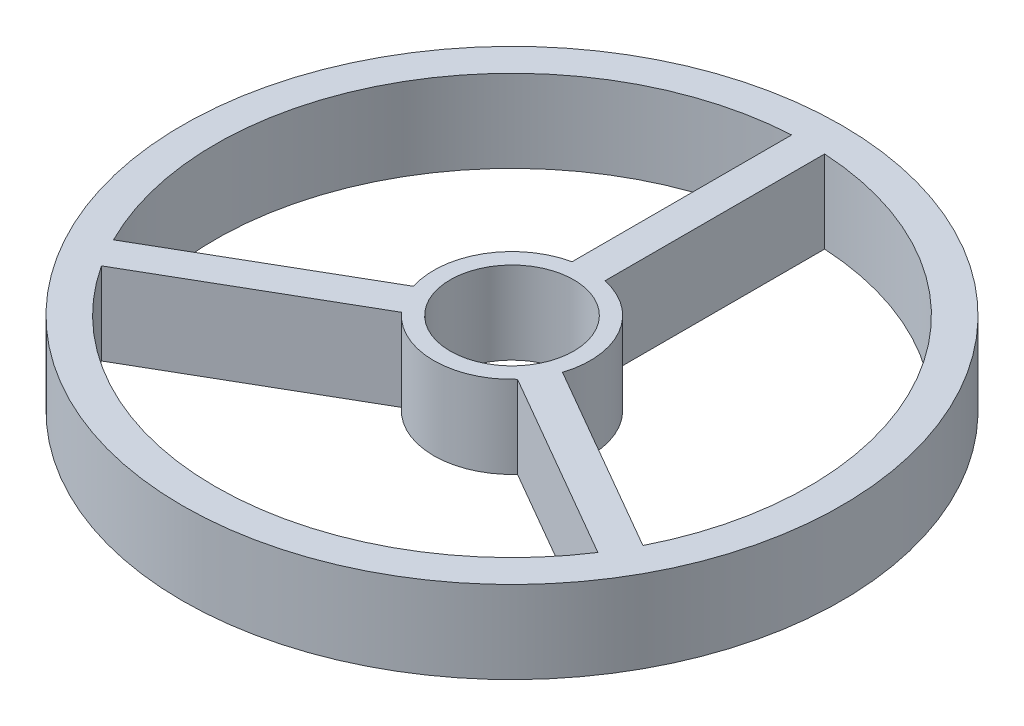
ISO-10303-21;
HEADER;
FILE_DESCRIPTION(('STEP AP214'),'2;1');
FILE_NAME('part.step','',(''),(''),'','','');
FILE_SCHEMA(('AUTOMOTIVE_DESIGN { 1 0 10303 214 1 1 1 1 }'));
ENDSEC;
DATA;
#1=APPLICATION_CONTEXT('core data for automotive mechanical design processes');
#2=APPLICATION_PROTOCOL_DEFINITION('international standard','automotive_design',2000,#1);
#3=PRODUCT_CONTEXT('',#1,'mechanical');
#4=PRODUCT('Part','Part','',(#3));
#5=PRODUCT_RELATED_PRODUCT_CATEGORY('part','',(#4));
#6=PRODUCT_DEFINITION_FORMATION('','',#4);
#7=PRODUCT_DEFINITION_CONTEXT('part definition',#1,'design');
#8=PRODUCT_DEFINITION('design','',#6,#7);
#9=PRODUCT_DEFINITION_SHAPE('','',#8);
#10=(LENGTH_UNIT() NAMED_UNIT(*) SI_UNIT(.MILLI.,.METRE.));
#11=(NAMED_UNIT(*) PLANE_ANGLE_UNIT() SI_UNIT($,.RADIAN.));
#12=(NAMED_UNIT(*) SI_UNIT($,.STERADIAN.) SOLID_ANGLE_UNIT());
#13=UNCERTAINTY_MEASURE_WITH_UNIT(LENGTH_MEASURE(1.E-05),#10,'distance_accuracy_value','');
#14=(GEOMETRIC_REPRESENTATION_CONTEXT(3) GLOBAL_UNCERTAINTY_ASSIGNED_CONTEXT((#13)) GLOBAL_UNIT_ASSIGNED_CONTEXT((#10,
#11,#12)) REPRESENTATION_CONTEXT('',''));
#15=CARTESIAN_POINT('',(0.,0.,0.));
#16=DIRECTION('',(0.,0.,1.));
#17=DIRECTION('',(1.,0.,0.));
#18=AXIS2_PLACEMENT_3D('',#15,#16,#17);
#19=CARTESIAN_POINT('',(0.,5.,0.));
#20=DIRECTION('',(0.,1.,0.));
#21=DIRECTION('',(0.,0.,1.));
#22=AXIS2_PLACEMENT_3D('',#19,#20,#21);
#23=PLANE('',#22);
#24=CARTESIAN_POINT('',(0.,5.,0.));
#25=DIRECTION('',(0.,1.,0.));
#26=DIRECTION('',(0.,0.,1.));
#27=AXIS2_PLACEMENT_3D('',#24,#25,#26);
#28=CIRCLE('',#27,40.);
#29=CARTESIAN_POINT('',(0.,5.,40.));
#30=VERTEX_POINT('',#29);
#31=EDGE_CURVE('E11',#30,#30,#28,.T.);
#32=ORIENTED_EDGE('',*,*,#31,.T.);
#33=EDGE_LOOP('',(#32));
#34=FACE_BOUND('',#33,.T.);
#35=CARTESIAN_POINT('',(0.,5.,0.));
#36=DIRECTION('',(0.,1.,0.));
#37=DIRECTION('',(0.,0.,1.));
#38=AXIS2_PLACEMENT_3D('',#35,#36,#37);
#39=CIRCLE('',#38,7.5);
#40=CARTESIAN_POINT('',(0.,5.,7.5));
#41=VERTEX_POINT('',#40);
#42=EDGE_CURVE('E224',#41,#41,#39,.T.);
#43=ORIENTED_EDGE('',*,*,#42,.F.);
#44=EDGE_LOOP('',(#43));
#45=FACE_BOUND('',#44,.T.);
#46=DIRECTION('',(-0.86602540378444,0.,0.499999999999998));
#47=VECTOR('',#46,1.);
#48=CARTESIAN_POINT('',(-7.04285397107272,5.,6.37559471282054));
#49=LINE('',#48,#47);
#50=CARTESIAN_POINT('',(-7.04285397107272,5.,6.37559471282054));
#51=VERTEX_POINT('',#50);
#52=CARTESIAN_POINT('',(-30.1287648325468,5.,19.7042515631802));
#53=VERTEX_POINT('',#52);
#54=EDGE_CURVE('E195',#51,#53,#49,.T.);
#55=ORIENTED_EDGE('',*,*,#54,.F.);
#56=CARTESIAN_POINT('',(0.,5.,0.));
#57=DIRECTION('',(0.,-1.,0.));
#58=DIRECTION('',(0.,0.,1.));
#59=AXIS2_PLACEMENT_3D('',#56,#57,#58);
#60=CIRCLE('',#59,9.5);
#61=CARTESIAN_POINT('',(7.04285397107271,5.,6.37559471282055));
#62=VERTEX_POINT('',#61);
#63=EDGE_CURVE('E193',#62,#51,#60,.T.);
#64=ORIENTED_EDGE('',*,*,#63,.F.);
#65=DIRECTION('',(-0.86602540378444,0.,-0.499999999999997));
#66=VECTOR('',#65,1.);
#67=CARTESIAN_POINT('',(7.04285397107271,5.,6.37559471282055));
#68=LINE('',#67,#66);
#69=CARTESIAN_POINT('',(30.1287648325468,5.,19.7042515631802));
#70=VERTEX_POINT('',#69);
#71=EDGE_CURVE('E201',#70,#62,#68,.T.);
#72=ORIENTED_EDGE('',*,*,#71,.F.);
#73=CARTESIAN_POINT('',(0.,5.,0.));
#74=DIRECTION('',(0.,1.,0.));
#75=DIRECTION('',(0.,0.,1.));
#76=AXIS2_PLACEMENT_3D('',#73,#74,#75);
#77=CIRCLE('',#76,36.);
#78=EDGE_CURVE('E198',#53,#70,#77,.T.);
#79=ORIENTED_EDGE('',*,*,#78,.F.);
#80=EDGE_LOOP('',(#55,#64,#72,#79));
#81=FACE_BOUND('',#80,.T.);
#82=DIRECTION('',(0.86602540378444,0.,0.499999999999997));
#83=VECTOR('',#82,1.);
#84=CARTESIAN_POINT('',(9.04285397107272,5.,2.91149309768277));
#85=LINE('',#84,#83);
#86=CARTESIAN_POINT('',(9.04285397107272,5.,2.91149309768277));
#87=VERTEX_POINT('',#86);
#88=CARTESIAN_POINT('',(32.1287648325468,5.,16.2401499480424));
#89=VERTEX_POINT('',#88);
#90=EDGE_CURVE('E164',#87,#89,#85,.T.);
#91=ORIENTED_EDGE('',*,*,#90,.F.);
#92=CARTESIAN_POINT('',(0.,5.,0.));
#93=DIRECTION('',(0.,-1.,0.));
#94=DIRECTION('',(0.,0.,1.));
#95=AXIS2_PLACEMENT_3D('',#92,#93,#94);
#96=CIRCLE('',#95,9.5);
#97=CARTESIAN_POINT('',(2.,5.,-9.28708781050336));
#98=VERTEX_POINT('',#97);
#99=EDGE_CURVE('E162',#98,#87,#96,.T.);
#100=ORIENTED_EDGE('',*,*,#99,.F.);
#101=DIRECTION('',(0.,0.,1.));
#102=VECTOR('',#101,1.);
#103=CARTESIAN_POINT('',(2.00000000000001,5.,-35.9444015112229));
#104=LINE('',#103,#102);
#105=CARTESIAN_POINT('',(2.00000000000001,5.,-35.9444015112229));
#106=VERTEX_POINT('',#105);
#107=EDGE_CURVE('E170',#106,#98,#104,.T.);
#108=ORIENTED_EDGE('',*,*,#107,.F.);
#109=CARTESIAN_POINT('',(0.,5.,0.));
#110=DIRECTION('',(0.,1.,0.));
#111=DIRECTION('',(0.,0.,1.));
#112=AXIS2_PLACEMENT_3D('',#109,#110,#111);
#113=CIRCLE('',#112,36.);
#114=EDGE_CURVE('E167',#89,#106,#113,.T.);
#115=ORIENTED_EDGE('',*,*,#114,.F.);
#116=EDGE_LOOP('',(#91,#100,#108,#115));
#117=FACE_BOUND('',#116,.T.);
#118=DIRECTION('',(0.,0.,-1.));
#119=VECTOR('',#118,1.);
#120=CARTESIAN_POINT('',(-2.00000000000013,5.,-35.9444015112228));
#121=LINE('',#120,#119);
#122=CARTESIAN_POINT('',(-2.00000000000004,5.,-9.28708781050335));
#123=VERTEX_POINT('',#122);
#124=CARTESIAN_POINT('',(-2.00000000000013,5.,-35.9444015112229));
#125=VERTEX_POINT('',#124);
#126=EDGE_CURVE('E134',#123,#125,#121,.T.);
#127=ORIENTED_EDGE('',*,*,#126,.F.);
#128=CARTESIAN_POINT('',(0.,5.,0.));
#129=DIRECTION('',(0.,-1.,0.));
#130=DIRECTION('',(0.,0.,1.));
#131=AXIS2_PLACEMENT_3D('',#128,#129,#130);
#132=CIRCLE('',#131,9.5);
#133=CARTESIAN_POINT('',(-9.04285397107271,5.,2.91149309768277));
#134=VERTEX_POINT('',#133);
#135=EDGE_CURVE('E126',#134,#123,#132,.T.);
#136=ORIENTED_EDGE('',*,*,#135,.F.);
#137=DIRECTION('',(0.86602540378444,0.,-0.499999999999998));
#138=VECTOR('',#137,1.);
#139=CARTESIAN_POINT('',(-9.04285397107271,5.,2.91149309768277));
#140=LINE('',#139,#138);
#141=CARTESIAN_POINT('',(-32.1287648325468,5.,16.2401499480425));
#142=VERTEX_POINT('',#141);
#143=EDGE_CURVE('E148',#142,#134,#140,.T.);
#144=ORIENTED_EDGE('',*,*,#143,.F.);
#145=CARTESIAN_POINT('',(0.,5.,0.));
#146=DIRECTION('',(0.,1.,0.));
#147=DIRECTION('',(0.,0.,1.));
#148=AXIS2_PLACEMENT_3D('',#145,#146,#147);
#149=CIRCLE('',#148,36.);
#150=EDGE_CURVE('E146',#125,#142,#149,.T.);
#151=ORIENTED_EDGE('',*,*,#150,.F.);
#152=EDGE_LOOP('',(#127,#136,#144,#151));
#153=FACE_BOUND('',#152,.T.);
#154=ADVANCED_FACE('F37',(#34,#45,#81,#117,#153),#23,.T.);
#155=CARTESIAN_POINT('',(0.,-5.,0.));
#156=DIRECTION('',(0.,1.,0.));
#157=DIRECTION('',(0.,0.,1.));
#158=AXIS2_PLACEMENT_3D('',#155,#156,#157);
#159=PLANE('',#158);
#160=CARTESIAN_POINT('',(0.,-5.,0.));
#161=DIRECTION('',(0.,-1.,0.));
#162=DIRECTION('',(0.,0.,1.));
#163=AXIS2_PLACEMENT_3D('',#160,#161,#162);
#164=CIRCLE('',#163,9.5);
#165=CARTESIAN_POINT('',(2.,-5.,-9.28708781050336));
#166=VERTEX_POINT('',#165);
#167=CARTESIAN_POINT('',(9.04285397107272,-5.,2.91149309768277));
#168=VERTEX_POINT('',#167);
#169=EDGE_CURVE('E142',#166,#168,#164,.T.);
#170=ORIENTED_EDGE('',*,*,#169,.T.);
#171=DIRECTION('',(0.86602540378444,0.,0.499999999999997));
#172=VECTOR('',#171,1.);
#173=CARTESIAN_POINT('',(9.04285397107272,-5.,2.91149309768277));
#174=LINE('',#173,#172);
#175=CARTESIAN_POINT('',(32.1287648325468,-5.,16.2401499480424));
#176=VERTEX_POINT('',#175);
#177=EDGE_CURVE('E175',#168,#176,#174,.T.);
#178=ORIENTED_EDGE('',*,*,#177,.T.);
#179=CARTESIAN_POINT('',(0.,-5.,0.));
#180=DIRECTION('',(0.,1.,0.));
#181=DIRECTION('',(0.,0.,1.));
#182=AXIS2_PLACEMENT_3D('',#179,#180,#181);
#183=CIRCLE('',#182,36.);
#184=CARTESIAN_POINT('',(2.00000000000001,-5.,-35.9444015112229));
#185=VERTEX_POINT('',#184);
#186=EDGE_CURVE('E178',#176,#185,#183,.T.);
#187=ORIENTED_EDGE('',*,*,#186,.T.);
#188=DIRECTION('',(0.,0.,1.));
#189=VECTOR('',#188,1.);
#190=CARTESIAN_POINT('',(2.00000000000001,-5.,-35.9444015112229));
#191=LINE('',#190,#189);
#192=EDGE_CURVE('E165',#185,#166,#191,.T.);
#193=ORIENTED_EDGE('',*,*,#192,.T.);
#194=EDGE_LOOP('',(#170,#178,#187,#193));
#195=FACE_BOUND('',#194,.T.);
#196=CARTESIAN_POINT('',(0.,-5.,0.));
#197=DIRECTION('',(0.,1.,0.));
#198=DIRECTION('',(0.,0.,1.));
#199=AXIS2_PLACEMENT_3D('',#196,#197,#198);
#200=CIRCLE('',#199,7.5);
#201=CARTESIAN_POINT('',(0.,-5.,7.5));
#202=VERTEX_POINT('',#201);
#203=EDGE_CURVE('E223',#202,#202,#200,.T.);
#204=ORIENTED_EDGE('',*,*,#203,.T.);
#205=EDGE_LOOP('',(#204));
#206=FACE_BOUND('',#205,.T.);
#207=CARTESIAN_POINT('',(0.,-5.,0.));
#208=DIRECTION('',(0.,1.,0.));
#209=DIRECTION('',(0.,0.,1.));
#210=AXIS2_PLACEMENT_3D('',#207,#208,#209);
#211=CIRCLE('',#210,40.);
#212=CARTESIAN_POINT('',(0.,-5.,40.));
#213=VERTEX_POINT('',#212);
#214=EDGE_CURVE('E41',#213,#213,#211,.T.);
#215=ORIENTED_EDGE('',*,*,#214,.F.);
#216=EDGE_LOOP('',(#215));
#217=FACE_BOUND('',#216,.T.);
#218=CARTESIAN_POINT('',(0.,-5.,0.));
#219=DIRECTION('',(0.,-1.,0.));
#220=DIRECTION('',(0.,0.,1.));
#221=AXIS2_PLACEMENT_3D('',#218,#219,#220);
#222=CIRCLE('',#221,9.5);
#223=CARTESIAN_POINT('',(7.04285397107271,-5.,6.37559471282055));
#224=VERTEX_POINT('',#223);
#225=CARTESIAN_POINT('',(-7.04285397107272,-5.,6.37559471282054));
#226=VERTEX_POINT('',#225);
#227=EDGE_CURVE('E192',#224,#226,#222,.T.);
#228=ORIENTED_EDGE('',*,*,#227,.T.);
#229=DIRECTION('',(-0.86602540378444,0.,0.499999999999998));
#230=VECTOR('',#229,1.);
#231=CARTESIAN_POINT('',(-7.04285397107272,-5.,6.37559471282054));
#232=LINE('',#231,#230);
#233=CARTESIAN_POINT('',(-30.1287648325468,-5.,19.7042515631802));
#234=VERTEX_POINT('',#233);
#235=EDGE_CURVE('E206',#226,#234,#232,.T.);
#236=ORIENTED_EDGE('',*,*,#235,.T.);
#237=CARTESIAN_POINT('',(0.,-5.,0.));
#238=DIRECTION('',(0.,1.,0.));
#239=DIRECTION('',(0.,0.,1.));
#240=AXIS2_PLACEMENT_3D('',#237,#238,#239);
#241=CIRCLE('',#240,36.);
#242=CARTESIAN_POINT('',(30.1287648325468,-5.,19.7042515631802));
#243=VERTEX_POINT('',#242);
#244=EDGE_CURVE('E209',#234,#243,#241,.T.);
#245=ORIENTED_EDGE('',*,*,#244,.T.);
#246=DIRECTION('',(-0.86602540378444,0.,-0.499999999999997));
#247=VECTOR('',#246,1.);
#248=CARTESIAN_POINT('',(7.04285397107271,-5.,6.37559471282055));
#249=LINE('',#248,#247);
#250=EDGE_CURVE('E196',#243,#224,#249,.T.);
#251=ORIENTED_EDGE('',*,*,#250,.T.);
#252=EDGE_LOOP('',(#228,#236,#245,#251));
#253=FACE_BOUND('',#252,.T.);
#254=CARTESIAN_POINT('',(0.,-5.,0.));
#255=DIRECTION('',(0.,-1.,0.));
#256=DIRECTION('',(0.,0.,1.));
#257=AXIS2_PLACEMENT_3D('',#254,#255,#256);
#258=CIRCLE('',#257,9.5);
#259=CARTESIAN_POINT('',(-9.04285397107272,-5.,2.91149309768277));
#260=VERTEX_POINT('',#259);
#261=CARTESIAN_POINT('',(-2.00000000000004,-5.,-9.28708781050335));
#262=VERTEX_POINT('',#261);
#263=EDGE_CURVE('E60',#260,#262,#258,.T.);
#264=ORIENTED_EDGE('',*,*,#263,.T.);
#265=DIRECTION('',(0.,0.,-1.));
#266=VECTOR('',#265,1.);
#267=CARTESIAN_POINT('',(-2.00000000000013,-5.,-35.9444015112228));
#268=LINE('',#267,#266);
#269=CARTESIAN_POINT('',(-2.00000000000013,-5.,-35.9444015112229));
#270=VERTEX_POINT('',#269);
#271=EDGE_CURVE('E141',#262,#270,#268,.T.);
#272=ORIENTED_EDGE('',*,*,#271,.T.);
#273=CARTESIAN_POINT('',(0.,-5.,0.));
#274=DIRECTION('',(0.,1.,0.));
#275=DIRECTION('',(0.,0.,1.));
#276=AXIS2_PLACEMENT_3D('',#273,#274,#275);
#277=CIRCLE('',#276,36.);
#278=CARTESIAN_POINT('',(-32.1287648325468,-5.,16.2401499480425));
#279=VERTEX_POINT('',#278);
#280=EDGE_CURVE('E154',#270,#279,#277,.T.);
#281=ORIENTED_EDGE('',*,*,#280,.T.);
#282=DIRECTION('',(0.86602540378444,0.,-0.499999999999998));
#283=VECTOR('',#282,1.);
#284=CARTESIAN_POINT('',(-9.04285397107271,-5.,2.91149309768277));
#285=LINE('',#284,#283);
#286=EDGE_CURVE('E135',#279,#260,#285,.T.);
#287=ORIENTED_EDGE('',*,*,#286,.T.);
#288=EDGE_LOOP('',(#264,#272,#281,#287));
#289=FACE_BOUND('',#288,.T.);
#290=ADVANCED_FACE('F230',(#195,#206,#217,#253,#289),#159,.F.);
#291=CARTESIAN_POINT('',(0.,5.,0.));
#292=DIRECTION('',(0.,-1.,0.));
#293=DIRECTION('',(0.,0.,-1.));
#294=AXIS2_PLACEMENT_3D('',#291,#292,#293);
#295=CYLINDRICAL_SURFACE('',#294,40.);
#296=ORIENTED_EDGE('',*,*,#31,.F.);
#297=EDGE_LOOP('',(#296));
#298=FACE_BOUND('',#297,.T.);
#299=ORIENTED_EDGE('',*,*,#214,.T.);
#300=EDGE_LOOP('',(#299));
#301=FACE_BOUND('',#300,.T.);
#302=ADVANCED_FACE('F39',(#298,#301),#295,.T.);
#303=CARTESIAN_POINT('',(0.,5.,0.));
#304=DIRECTION('',(0.,-1.,0.));
#305=DIRECTION('',(0.,0.,-1.));
#306=AXIS2_PLACEMENT_3D('',#303,#304,#305);
#307=CYLINDRICAL_SURFACE('',#306,7.5);
#308=ORIENTED_EDGE('',*,*,#42,.T.);
#309=EDGE_LOOP('',(#308));
#310=FACE_BOUND('',#309,.T.);
#311=ORIENTED_EDGE('',*,*,#203,.F.);
#312=EDGE_LOOP('',(#311));
#313=FACE_BOUND('',#312,.T.);
#314=ADVANCED_FACE('F233',(#310,#313),#307,.F.);
#315=CARTESIAN_POINT('',(0.,5.,0.));
#316=DIRECTION('',(0.,-1.,0.));
#317=DIRECTION('',(0.,0.,-1.));
#318=AXIS2_PLACEMENT_3D('',#315,#316,#317);
#319=CYLINDRICAL_SURFACE('',#318,9.5);
#320=ORIENTED_EDGE('',*,*,#227,.F.);
#321=DIRECTION('',(0.,-1.,0.));
#322=VECTOR('',#321,1.);
#323=CARTESIAN_POINT('',(7.04285397107271,5.,6.37559471282055));
#324=LINE('',#323,#322);
#325=EDGE_CURVE('E203',#62,#224,#324,.T.);
#326=ORIENTED_EDGE('',*,*,#325,.F.);
#327=ORIENTED_EDGE('',*,*,#63,.T.);
#328=DIRECTION('',(0.,-1.,0.));
#329=VECTOR('',#328,1.);
#330=CARTESIAN_POINT('',(-7.04285397107272,5.,6.37559471282054));
#331=LINE('',#330,#329);
#332=EDGE_CURVE('E220',#51,#226,#331,.T.);
#333=ORIENTED_EDGE('',*,*,#332,.T.);
#334=EDGE_LOOP('',(#320,#326,#327,#333));
#335=FACE_BOUND('',#334,.T.);
#336=ADVANCED_FACE('F235',(#335),#319,.T.);
#337=CARTESIAN_POINT('',(-7.04285397107272,5.,6.37559471282054));
#338=DIRECTION('',(0.499999999999998,0.,0.86602540378444));
#339=DIRECTION('',(0.86602540378444,0.,-0.499999999999998));
#340=AXIS2_PLACEMENT_3D('',#337,#338,#339);
#341=PLANE('',#340);
#342=ORIENTED_EDGE('',*,*,#235,.F.);
#343=ORIENTED_EDGE('',*,*,#332,.F.);
#344=ORIENTED_EDGE('',*,*,#54,.T.);
#345=DIRECTION('',(0.,-1.,0.));
#346=VECTOR('',#345,1.);
#347=CARTESIAN_POINT('',(-30.1287648325468,5.,19.7042515631802));
#348=LINE('',#347,#346);
#349=EDGE_CURVE('E218',#53,#234,#348,.T.);
#350=ORIENTED_EDGE('',*,*,#349,.T.);
#351=EDGE_LOOP('',(#342,#343,#344,#350));
#352=FACE_BOUND('',#351,.T.);
#353=ADVANCED_FACE('F242',(#352),#341,.T.);
#354=CARTESIAN_POINT('',(0.,5.,0.));
#355=DIRECTION('',(0.,-1.,0.));
#356=DIRECTION('',(0.,0.,-1.));
#357=AXIS2_PLACEMENT_3D('',#354,#355,#356);
#358=CYLINDRICAL_SURFACE('',#357,36.);
#359=ORIENTED_EDGE('',*,*,#244,.F.);
#360=ORIENTED_EDGE('',*,*,#349,.F.);
#361=ORIENTED_EDGE('',*,*,#78,.T.);
#362=DIRECTION('',(0.,-1.,0.));
#363=VECTOR('',#362,1.);
#364=CARTESIAN_POINT('',(30.1287648325468,5.,19.7042515631802));
#365=LINE('',#364,#363);
#366=EDGE_CURVE('E216',#70,#243,#365,.T.);
#367=ORIENTED_EDGE('',*,*,#366,.T.);
#368=EDGE_LOOP('',(#359,#360,#361,#367));
#369=FACE_BOUND('',#368,.T.);
#370=ADVANCED_FACE('F295',(#369),#358,.F.);
#371=CARTESIAN_POINT('',(7.04285397107271,5.,6.37559471282055));
#372=DIRECTION('',(-0.499999999999997,0.,0.86602540378444));
#373=DIRECTION('',(0.86602540378444,0.,0.499999999999997));
#374=AXIS2_PLACEMENT_3D('',#371,#372,#373);
#375=PLANE('',#374);
#376=ORIENTED_EDGE('',*,*,#250,.F.);
#377=ORIENTED_EDGE('',*,*,#366,.F.);
#378=ORIENTED_EDGE('',*,*,#71,.T.);
#379=ORIENTED_EDGE('',*,*,#325,.T.);
#380=EDGE_LOOP('',(#376,#377,#378,#379));
#381=FACE_BOUND('',#380,.T.);
#382=ADVANCED_FACE('F292',(#381),#375,.T.);
#383=CARTESIAN_POINT('',(0.,5.,0.));
#384=DIRECTION('',(0.,-1.,0.));
#385=DIRECTION('',(0.,0.,-1.));
#386=AXIS2_PLACEMENT_3D('',#383,#384,#385);
#387=CYLINDRICAL_SURFACE('',#386,9.5);
#388=ORIENTED_EDGE('',*,*,#169,.F.);
#389=DIRECTION('',(0.,-1.,0.));
#390=VECTOR('',#389,1.);
#391=CARTESIAN_POINT('',(2.,5.,-9.28708781050336));
#392=LINE('',#391,#390);
#393=EDGE_CURVE('E172',#98,#166,#392,.T.);
#394=ORIENTED_EDGE('',*,*,#393,.F.);
#395=ORIENTED_EDGE('',*,*,#99,.T.);
#396=DIRECTION('',(0.,-1.,0.));
#397=VECTOR('',#396,1.);
#398=CARTESIAN_POINT('',(9.04285397107272,5.,2.91149309768277));
#399=LINE('',#398,#397);
#400=EDGE_CURVE('E189',#87,#168,#399,.T.);
#401=ORIENTED_EDGE('',*,*,#400,.T.);
#402=EDGE_LOOP('',(#388,#394,#395,#401));
#403=FACE_BOUND('',#402,.T.);
#404=ADVANCED_FACE('F274',(#403),#387,.T.);
#405=CARTESIAN_POINT('',(9.04285397107272,5.,2.91149309768277));
#406=DIRECTION('',(0.499999999999997,0.,-0.86602540378444));
#407=DIRECTION('',(-0.86602540378444,0.,-0.499999999999997));
#408=AXIS2_PLACEMENT_3D('',#405,#406,#407);
#409=PLANE('',#408);
#410=ORIENTED_EDGE('',*,*,#177,.F.);
#411=ORIENTED_EDGE('',*,*,#400,.F.);
#412=ORIENTED_EDGE('',*,*,#90,.T.);
#413=DIRECTION('',(0.,-1.,0.));
#414=VECTOR('',#413,1.);
#415=CARTESIAN_POINT('',(32.1287648325468,5.,16.2401499480424));
#416=LINE('',#415,#414);
#417=EDGE_CURVE('E187',#89,#176,#416,.T.);
#418=ORIENTED_EDGE('',*,*,#417,.T.);
#419=EDGE_LOOP('',(#410,#411,#412,#418));
#420=FACE_BOUND('',#419,.T.);
#421=ADVANCED_FACE('F268',(#420),#409,.T.);
#422=CARTESIAN_POINT('',(0.,5.,0.));
#423=DIRECTION('',(0.,-1.,0.));
#424=DIRECTION('',(0.,0.,-1.));
#425=AXIS2_PLACEMENT_3D('',#422,#423,#424);
#426=CYLINDRICAL_SURFACE('',#425,36.);
#427=ORIENTED_EDGE('',*,*,#186,.F.);
#428=ORIENTED_EDGE('',*,*,#417,.F.);
#429=ORIENTED_EDGE('',*,*,#114,.T.);
#430=DIRECTION('',(0.,-1.,0.));
#431=VECTOR('',#430,1.);
#432=CARTESIAN_POINT('',(2.00000000000001,5.,-35.9444015112229));
#433=LINE('',#432,#431);
#434=EDGE_CURVE('E185',#106,#185,#433,.T.);
#435=ORIENTED_EDGE('',*,*,#434,.T.);
#436=EDGE_LOOP('',(#427,#428,#429,#435));
#437=FACE_BOUND('',#436,.T.);
#438=ADVANCED_FACE('F271',(#437),#426,.F.);
#439=CARTESIAN_POINT('',(2.00000000000001,5.,-35.9444015112229));
#440=DIRECTION('',(1.,0.,0.));
#441=DIRECTION('',(0.,0.,-1.));
#442=AXIS2_PLACEMENT_3D('',#439,#440,#441);
#443=PLANE('',#442);
#444=ORIENTED_EDGE('',*,*,#192,.F.);
#445=ORIENTED_EDGE('',*,*,#434,.F.);
#446=ORIENTED_EDGE('',*,*,#107,.T.);
#447=ORIENTED_EDGE('',*,*,#393,.T.);
#448=EDGE_LOOP('',(#444,#445,#446,#447));
#449=FACE_BOUND('',#448,.T.);
#450=ADVANCED_FACE('F277',(#449),#443,.T.);
#451=CARTESIAN_POINT('',(0.,5.,0.));
#452=DIRECTION('',(0.,-1.,0.));
#453=DIRECTION('',(0.,0.,-1.));
#454=AXIS2_PLACEMENT_3D('',#451,#452,#453);
#455=CYLINDRICAL_SURFACE('',#454,9.5);
#456=ORIENTED_EDGE('',*,*,#263,.F.);
#457=DIRECTION('',(0.,-1.,0.));
#458=VECTOR('',#457,1.);
#459=CARTESIAN_POINT('',(-9.04285397107271,5.,2.91149309768277));
#460=LINE('',#459,#458);
#461=EDGE_CURVE('E130',#134,#260,#460,.T.);
#462=ORIENTED_EDGE('',*,*,#461,.F.);
#463=ORIENTED_EDGE('',*,*,#135,.T.);
#464=DIRECTION('',(0.,-1.,0.));
#465=VECTOR('',#464,1.);
#466=CARTESIAN_POINT('',(-2.00000000000004,5.,-9.28708781050335));
#467=LINE('',#466,#465);
#468=EDGE_CURVE('E129',#123,#262,#467,.T.);
#469=ORIENTED_EDGE('',*,*,#468,.T.);
#470=EDGE_LOOP('',(#456,#462,#463,#469));
#471=FACE_BOUND('',#470,.T.);
#472=ADVANCED_FACE('F128',(#471),#455,.T.);
#473=CARTESIAN_POINT('',(-2.00000000000013,5.,-35.9444015112228));
#474=DIRECTION('',(-1.,0.,0.));
#475=DIRECTION('',(0.,0.,1.));
#476=AXIS2_PLACEMENT_3D('',#473,#474,#475);
#477=PLANE('',#476);
#478=ORIENTED_EDGE('',*,*,#271,.F.);
#479=ORIENTED_EDGE('',*,*,#468,.F.);
#480=ORIENTED_EDGE('',*,*,#126,.T.);
#481=DIRECTION('',(0.,-1.,0.));
#482=VECTOR('',#481,1.);
#483=CARTESIAN_POINT('',(-2.00000000000013,5.,-35.9444015112229));
#484=LINE('',#483,#482);
#485=EDGE_CURVE('E143',#125,#270,#484,.T.);
#486=ORIENTED_EDGE('',*,*,#485,.T.);
#487=EDGE_LOOP('',(#478,#479,#480,#486));
#488=FACE_BOUND('',#487,.T.);
#489=ADVANCED_FACE('F138',(#488),#477,.T.);
#490=CARTESIAN_POINT('',(0.,5.,0.));
#491=DIRECTION('',(0.,-1.,0.));
#492=DIRECTION('',(0.,0.,-1.));
#493=AXIS2_PLACEMENT_3D('',#490,#491,#492);
#494=CYLINDRICAL_SURFACE('',#493,36.);
#495=ORIENTED_EDGE('',*,*,#280,.F.);
#496=ORIENTED_EDGE('',*,*,#485,.F.);
#497=ORIENTED_EDGE('',*,*,#150,.T.);
#498=DIRECTION('',(0.,-1.,0.));
#499=VECTOR('',#498,1.);
#500=CARTESIAN_POINT('',(-32.1287648325468,5.,16.2401499480425));
#501=LINE('',#500,#499);
#502=EDGE_CURVE('E52',#142,#279,#501,.T.);
#503=ORIENTED_EDGE('',*,*,#502,.T.);
#504=EDGE_LOOP('',(#495,#496,#497,#503));
#505=FACE_BOUND('',#504,.T.);
#506=ADVANCED_FACE('F315',(#505),#494,.F.);
#507=CARTESIAN_POINT('',(-9.04285397107271,5.,2.91149309768277));
#508=DIRECTION('',(-0.499999999999998,0.,-0.86602540378444));
#509=DIRECTION('',(-0.86602540378444,0.,0.499999999999998));
#510=AXIS2_PLACEMENT_3D('',#507,#508,#509);
#511=PLANE('',#510);
#512=ORIENTED_EDGE('',*,*,#286,.F.);
#513=ORIENTED_EDGE('',*,*,#502,.F.);
#514=ORIENTED_EDGE('',*,*,#143,.T.);
#515=ORIENTED_EDGE('',*,*,#461,.T.);
#516=EDGE_LOOP('',(#512,#513,#514,#515));
#517=FACE_BOUND('',#516,.T.);
#518=ADVANCED_FACE('F313',(#517),#511,.T.);
#519=CLOSED_SHELL('',(#154,#290,#302,#314,#336,#353,#370,#382,#404,#421,#438,#450,#472,#489,
#506,#518));
#520=MANIFOLD_SOLID_BREP('B2',#519);
#521=ADVANCED_BREP_SHAPE_REPRESENTATION('',(#18,#520),#14);
#522=SHAPE_DEFINITION_REPRESENTATION(#9,#521);
ENDSEC;
END-ISO-10303-21;
